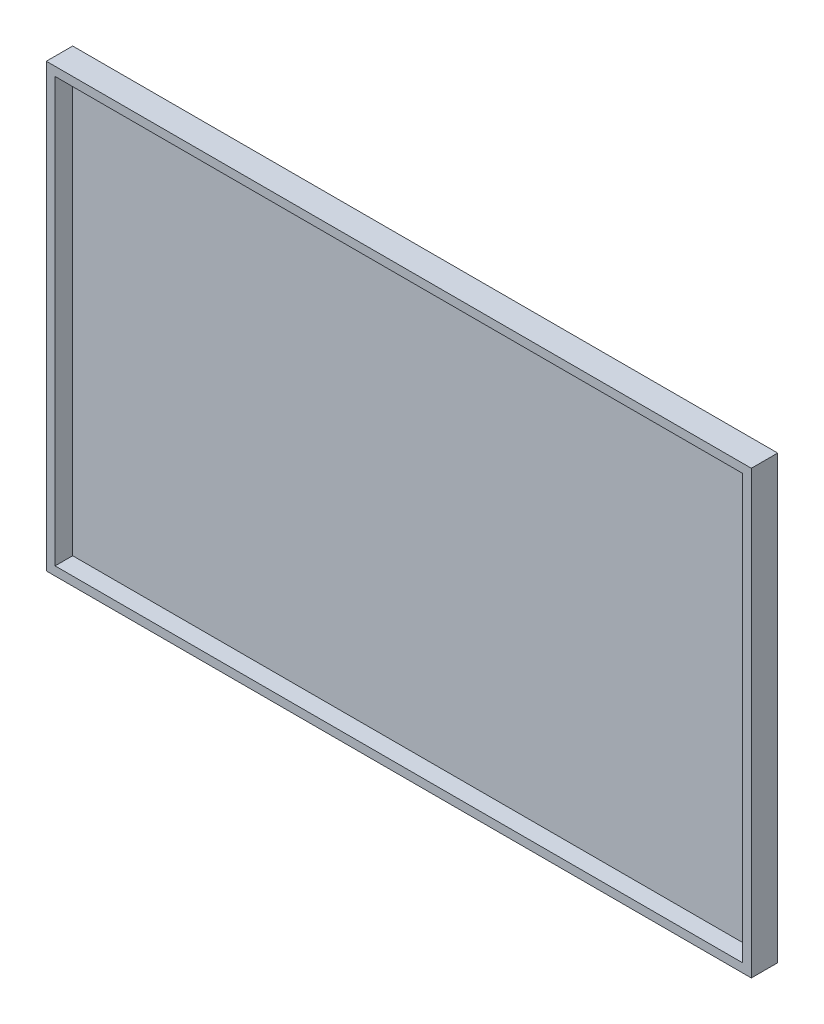
ISO-10303-21;
HEADER;
FILE_DESCRIPTION(('STEP AP214'),'2;1');
FILE_NAME('part.step','',(''),(''),'','','');
FILE_SCHEMA(('AUTOMOTIVE_DESIGN { 1 0 10303 214 1 1 1 1 }'));
ENDSEC;
DATA;
#1=APPLICATION_CONTEXT('core data for automotive mechanical design processes');
#2=APPLICATION_PROTOCOL_DEFINITION('international standard','automotive_design',2000,#1);
#3=PRODUCT_CONTEXT('',#1,'mechanical');
#4=PRODUCT('Part','Part','',(#3));
#5=PRODUCT_RELATED_PRODUCT_CATEGORY('part','',(#4));
#6=PRODUCT_DEFINITION_FORMATION('','',#4);
#7=PRODUCT_DEFINITION_CONTEXT('part definition',#1,'design');
#8=PRODUCT_DEFINITION('design','',#6,#7);
#9=PRODUCT_DEFINITION_SHAPE('','',#8);
#10=(LENGTH_UNIT() NAMED_UNIT(*) SI_UNIT(.MILLI.,.METRE.));
#11=(NAMED_UNIT(*) PLANE_ANGLE_UNIT() SI_UNIT($,.RADIAN.));
#12=(NAMED_UNIT(*) SI_UNIT($,.STERADIAN.) SOLID_ANGLE_UNIT());
#13=UNCERTAINTY_MEASURE_WITH_UNIT(LENGTH_MEASURE(1.E-05),#10,'distance_accuracy_value','');
#14=(GEOMETRIC_REPRESENTATION_CONTEXT(3) GLOBAL_UNCERTAINTY_ASSIGNED_CONTEXT((#13)) GLOBAL_UNIT_ASSIGNED_CONTEXT((#10,
#11,#12)) REPRESENTATION_CONTEXT('',''));
#15=CARTESIAN_POINT('',(0.,0.,0.));
#16=DIRECTION('',(0.,0.,1.));
#17=DIRECTION('',(1.,0.,0.));
#18=AXIS2_PLACEMENT_3D('',#15,#16,#17);
#19=CARTESIAN_POINT('',(-51.1381031613977,30.2179700499168,2.));
#20=DIRECTION('',(1.,0.,0.));
#21=DIRECTION('',(0.,1.,0.));
#22=AXIS2_PLACEMENT_3D('',#19,#20,#21);
#23=PLANE('',#22);
#24=DIRECTION('',(0.,-1.,0.));
#25=VECTOR('',#24,1.);
#26=CARTESIAN_POINT('',(-51.1381031613977,30.2179700499168,0.));
#27=LINE('',#26,#25);
#28=CARTESIAN_POINT('',(-51.1381031613977,30.2179700499168,0.));
#29=VERTEX_POINT('',#28);
#30=CARTESIAN_POINT('',(-51.1381031613976,-70.2820299500832,0.));
#31=VERTEX_POINT('',#30);
#32=EDGE_CURVE('E144',#29,#31,#27,.T.);
#33=ORIENTED_EDGE('',*,*,#32,.T.);
#34=DIRECTION('',(0.,0.,-1.));
#35=VECTOR('',#34,1.);
#36=CARTESIAN_POINT('',(-51.1381031613976,-70.2820299500832,2.));
#37=LINE('',#36,#35);
#38=CARTESIAN_POINT('',(-51.1381031613977,-70.2820299500832,6.));
#39=VERTEX_POINT('',#38);
#40=EDGE_CURVE('E11',#39,#31,#37,.T.);
#41=ORIENTED_EDGE('',*,*,#40,.F.);
#42=DIRECTION('',(0.,-1.,0.));
#43=VECTOR('',#42,1.);
#44=CARTESIAN_POINT('',(-51.1381031613977,30.2179700499168,6.));
#45=LINE('',#44,#43);
#46=CARTESIAN_POINT('',(-51.1381031613977,30.2179700499168,6.));
#47=VERTEX_POINT('',#46);
#48=EDGE_CURVE('E111',#47,#39,#45,.T.);
#49=ORIENTED_EDGE('',*,*,#48,.F.);
#50=DIRECTION('',(0.,0.,-1.));
#51=VECTOR('',#50,1.);
#52=CARTESIAN_POINT('',(-51.1381031613977,30.2179700499168,2.));
#53=LINE('',#52,#51);
#54=EDGE_CURVE('E153',#47,#29,#53,.T.);
#55=ORIENTED_EDGE('',*,*,#54,.T.);
#56=EDGE_LOOP('',(#33,#41,#49,#55));
#57=FACE_BOUND('',#56,.T.);
#58=ADVANCED_FACE('F33',(#57),#23,.F.);
#59=CARTESIAN_POINT('',(-51.1381031613976,-70.2820299500832,2.));
#60=DIRECTION('',(0.,1.,0.));
#61=DIRECTION('',(0.,0.,1.));
#62=AXIS2_PLACEMENT_3D('',#59,#60,#61);
#63=PLANE('',#62);
#64=DIRECTION('',(1.,0.,0.));
#65=VECTOR('',#64,1.);
#66=CARTESIAN_POINT('',(-51.1381031613976,-70.2820299500832,0.));
#67=LINE('',#66,#65);
#68=CARTESIAN_POINT('',(109.361896838602,-70.2820299500832,0.));
#69=VERTEX_POINT('',#68);
#70=EDGE_CURVE('E147',#31,#69,#67,.T.);
#71=ORIENTED_EDGE('',*,*,#70,.T.);
#72=DIRECTION('',(0.,0.,-1.));
#73=VECTOR('',#72,1.);
#74=CARTESIAN_POINT('',(109.361896838602,-70.2820299500832,2.));
#75=LINE('',#74,#73);
#76=CARTESIAN_POINT('',(109.361896838602,-70.2820299500832,6.));
#77=VERTEX_POINT('',#76);
#78=EDGE_CURVE('E40',#77,#69,#75,.T.);
#79=ORIENTED_EDGE('',*,*,#78,.F.);
#80=DIRECTION('',(1.,0.,0.));
#81=VECTOR('',#80,1.);
#82=CARTESIAN_POINT('',(-51.1381031613977,-70.2820299500832,6.));
#83=LINE('',#82,#81);
#84=EDGE_CURVE('E135',#39,#77,#83,.T.);
#85=ORIENTED_EDGE('',*,*,#84,.F.);
#86=ORIENTED_EDGE('',*,*,#40,.T.);
#87=EDGE_LOOP('',(#71,#79,#85,#86));
#88=FACE_BOUND('',#87,.T.);
#89=ADVANCED_FACE('F175',(#88),#63,.F.);
#90=CARTESIAN_POINT('',(109.361896838602,30.2179700499168,2.));
#91=DIRECTION('',(-1.,0.,0.));
#92=DIRECTION('',(0.,0.,1.));
#93=AXIS2_PLACEMENT_3D('',#90,#91,#92);
#94=PLANE('',#93);
#95=DIRECTION('',(0.,1.,0.));
#96=VECTOR('',#95,1.);
#97=CARTESIAN_POINT('',(109.361896838602,30.2179700499168,0.));
#98=LINE('',#97,#96);
#99=CARTESIAN_POINT('',(109.361896838602,30.2179700499168,0.));
#100=VERTEX_POINT('',#99);
#101=EDGE_CURVE('E149',#69,#100,#98,.T.);
#102=ORIENTED_EDGE('',*,*,#101,.T.);
#103=DIRECTION('',(0.,0.,-1.));
#104=VECTOR('',#103,1.);
#105=CARTESIAN_POINT('',(109.361896838602,30.2179700499168,2.));
#106=LINE('',#105,#104);
#107=CARTESIAN_POINT('',(109.361896838602,30.2179700499168,6.));
#108=VERTEX_POINT('',#107);
#109=EDGE_CURVE('E156',#108,#100,#106,.T.);
#110=ORIENTED_EDGE('',*,*,#109,.F.);
#111=DIRECTION('',(0.,1.,0.));
#112=VECTOR('',#111,1.);
#113=CARTESIAN_POINT('',(109.361896838602,30.2179700499168,6.));
#114=LINE('',#113,#112);
#115=EDGE_CURVE('E138',#77,#108,#114,.T.);
#116=ORIENTED_EDGE('',*,*,#115,.F.);
#117=ORIENTED_EDGE('',*,*,#78,.T.);
#118=EDGE_LOOP('',(#102,#110,#116,#117));
#119=FACE_BOUND('',#118,.T.);
#120=ADVANCED_FACE('F162',(#119),#94,.F.);
#121=CARTESIAN_POINT('',(-51.1381031613977,30.2179700499168,2.));
#122=DIRECTION('',(0.,-1.,0.));
#123=DIRECTION('',(0.,0.,-1.));
#124=AXIS2_PLACEMENT_3D('',#121,#122,#123);
#125=PLANE('',#124);
#126=DIRECTION('',(-1.,0.,0.));
#127=VECTOR('',#126,1.);
#128=CARTESIAN_POINT('',(-51.1381031613977,30.2179700499168,0.));
#129=LINE('',#128,#127);
#130=EDGE_CURVE('E151',#100,#29,#129,.T.);
#131=ORIENTED_EDGE('',*,*,#130,.T.);
#132=ORIENTED_EDGE('',*,*,#54,.F.);
#133=DIRECTION('',(-1.,0.,0.));
#134=VECTOR('',#133,1.);
#135=CARTESIAN_POINT('',(-51.1381031613977,30.2179700499168,6.));
#136=LINE('',#135,#134);
#137=EDGE_CURVE('E141',#108,#47,#136,.T.);
#138=ORIENTED_EDGE('',*,*,#137,.F.);
#139=ORIENTED_EDGE('',*,*,#109,.T.);
#140=EDGE_LOOP('',(#131,#132,#138,#139));
#141=FACE_BOUND('',#140,.T.);
#142=ADVANCED_FACE('F170',(#141),#125,.F.);
#143=CARTESIAN_POINT('',(0.,0.,0.));
#144=DIRECTION('',(0.,0.,1.));
#145=DIRECTION('',(1.,0.,0.));
#146=AXIS2_PLACEMENT_3D('',#143,#144,#145);
#147=PLANE('',#146);
#148=ORIENTED_EDGE('',*,*,#32,.F.);
#149=ORIENTED_EDGE('',*,*,#130,.F.);
#150=ORIENTED_EDGE('',*,*,#101,.F.);
#151=ORIENTED_EDGE('',*,*,#70,.F.);
#152=EDGE_LOOP('',(#148,#149,#150,#151));
#153=FACE_BOUND('',#152,.T.);
#154=ADVANCED_FACE('F168',(#153),#147,.F.);
#155=CARTESIAN_POINT('',(0.,0.,6.));
#156=DIRECTION('',(0.,0.,1.));
#157=DIRECTION('',(1.,0.,0.));
#158=AXIS2_PLACEMENT_3D('',#155,#156,#157);
#159=PLANE('',#158);
#160=ORIENTED_EDGE('',*,*,#48,.T.);
#161=ORIENTED_EDGE('',*,*,#84,.T.);
#162=ORIENTED_EDGE('',*,*,#115,.T.);
#163=ORIENTED_EDGE('',*,*,#137,.T.);
#164=EDGE_LOOP('',(#160,#161,#162,#163));
#165=FACE_BOUND('',#164,.T.);
#166=DIRECTION('',(1.,0.,0.));
#167=VECTOR('',#166,1.);
#168=CARTESIAN_POINT('',(-49.1381031613976,-68.2820299500832,6.));
#169=LINE('',#168,#167);
#170=CARTESIAN_POINT('',(-49.1381031613976,-68.2820299500832,6.));
#171=VERTEX_POINT('',#170);
#172=CARTESIAN_POINT('',(107.361896838602,-68.2820299500832,6.));
#173=VERTEX_POINT('',#172);
#174=EDGE_CURVE('E105',#171,#173,#169,.T.);
#175=ORIENTED_EDGE('',*,*,#174,.F.);
#176=DIRECTION('',(0.,-1.,0.));
#177=VECTOR('',#176,1.);
#178=CARTESIAN_POINT('',(-49.1381031613977,28.2179700499168,6.));
#179=LINE('',#178,#177);
#180=CARTESIAN_POINT('',(-49.1381031613977,28.2179700499168,6.));
#181=VERTEX_POINT('',#180);
#182=EDGE_CURVE('E96',#181,#171,#179,.T.);
#183=ORIENTED_EDGE('',*,*,#182,.F.);
#184=DIRECTION('',(-1.,0.,0.));
#185=VECTOR('',#184,1.);
#186=CARTESIAN_POINT('',(-49.1381031613977,28.2179700499168,6.));
#187=LINE('',#186,#185);
#188=CARTESIAN_POINT('',(107.361896838602,28.2179700499168,6.));
#189=VERTEX_POINT('',#188);
#190=EDGE_CURVE('E119',#189,#181,#187,.T.);
#191=ORIENTED_EDGE('',*,*,#190,.F.);
#192=DIRECTION('',(0.,1.,0.));
#193=VECTOR('',#192,1.);
#194=CARTESIAN_POINT('',(107.361896838602,28.2179700499168,6.));
#195=LINE('',#194,#193);
#196=EDGE_CURVE('E117',#173,#189,#195,.T.);
#197=ORIENTED_EDGE('',*,*,#196,.F.);
#198=EDGE_LOOP('',(#175,#183,#191,#197));
#199=FACE_BOUND('',#198,.T.);
#200=ADVANCED_FACE('F115',(#165,#199),#159,.T.);
#201=CARTESIAN_POINT('',(-49.1381031613977,28.2179700499168,6.));
#202=DIRECTION('',(1.,0.,0.));
#203=DIRECTION('',(0.,1.,0.));
#204=AXIS2_PLACEMENT_3D('',#201,#202,#203);
#205=PLANE('',#204);
#206=DIRECTION('',(0.,-1.,0.));
#207=VECTOR('',#206,1.);
#208=CARTESIAN_POINT('',(-49.1381031613977,28.2179700499168,2.));
#209=LINE('',#208,#207);
#210=CARTESIAN_POINT('',(-49.1381031613977,28.2179700499168,2.));
#211=VERTEX_POINT('',#210);
#212=CARTESIAN_POINT('',(-49.1381031613976,-68.2820299500832,2.));
#213=VERTEX_POINT('',#212);
#214=EDGE_CURVE('E47',#211,#213,#209,.T.);
#215=ORIENTED_EDGE('',*,*,#214,.F.);
#216=DIRECTION('',(0.,0.,-1.));
#217=VECTOR('',#216,1.);
#218=CARTESIAN_POINT('',(-49.1381031613977,28.2179700499168,6.));
#219=LINE('',#218,#217);
#220=EDGE_CURVE('E101',#181,#211,#219,.T.);
#221=ORIENTED_EDGE('',*,*,#220,.F.);
#222=ORIENTED_EDGE('',*,*,#182,.T.);
#223=DIRECTION('',(0.,0.,-1.));
#224=VECTOR('',#223,1.);
#225=CARTESIAN_POINT('',(-49.1381031613976,-68.2820299500832,6.));
#226=LINE('',#225,#224);
#227=EDGE_CURVE('E99',#171,#213,#226,.T.);
#228=ORIENTED_EDGE('',*,*,#227,.T.);
#229=EDGE_LOOP('',(#215,#221,#222,#228));
#230=FACE_BOUND('',#229,.T.);
#231=ADVANCED_FACE('F98',(#230),#205,.T.);
#232=CARTESIAN_POINT('',(-49.1381031613976,-68.2820299500832,6.));
#233=DIRECTION('',(0.,1.,0.));
#234=DIRECTION('',(0.,0.,1.));
#235=AXIS2_PLACEMENT_3D('',#232,#233,#234);
#236=PLANE('',#235);
#237=DIRECTION('',(1.,0.,0.));
#238=VECTOR('',#237,1.);
#239=CARTESIAN_POINT('',(-49.1381031613976,-68.2820299500832,2.));
#240=LINE('',#239,#238);
#241=CARTESIAN_POINT('',(107.361896838602,-68.2820299500832,2.));
#242=VERTEX_POINT('',#241);
#243=EDGE_CURVE('E51',#213,#242,#240,.T.);
#244=ORIENTED_EDGE('',*,*,#243,.F.);
#245=ORIENTED_EDGE('',*,*,#227,.F.);
#246=ORIENTED_EDGE('',*,*,#174,.T.);
#247=DIRECTION('',(0.,0.,-1.));
#248=VECTOR('',#247,1.);
#249=CARTESIAN_POINT('',(107.361896838602,-68.2820299500832,6.));
#250=LINE('',#249,#248);
#251=EDGE_CURVE('E112',#173,#242,#250,.T.);
#252=ORIENTED_EDGE('',*,*,#251,.T.);
#253=EDGE_LOOP('',(#244,#245,#246,#252));
#254=FACE_BOUND('',#253,.T.);
#255=ADVANCED_FACE('F109',(#254),#236,.T.);
#256=CARTESIAN_POINT('',(107.361896838602,28.2179700499168,6.));
#257=DIRECTION('',(-1.,0.,0.));
#258=DIRECTION('',(0.,-1.,0.));
#259=AXIS2_PLACEMENT_3D('',#256,#257,#258);
#260=PLANE('',#259);
#261=DIRECTION('',(0.,1.,0.));
#262=VECTOR('',#261,1.);
#263=CARTESIAN_POINT('',(107.361896838602,28.2179700499168,2.));
#264=LINE('',#263,#262);
#265=CARTESIAN_POINT('',(107.361896838602,28.2179700499168,2.));
#266=VERTEX_POINT('',#265);
#267=EDGE_CURVE('E125',#242,#266,#264,.T.);
#268=ORIENTED_EDGE('',*,*,#267,.F.);
#269=ORIENTED_EDGE('',*,*,#251,.F.);
#270=ORIENTED_EDGE('',*,*,#196,.T.);
#271=DIRECTION('',(0.,0.,-1.));
#272=VECTOR('',#271,1.);
#273=CARTESIAN_POINT('',(107.361896838602,28.2179700499168,6.));
#274=LINE('',#273,#272);
#275=EDGE_CURVE('E129',#189,#266,#274,.T.);
#276=ORIENTED_EDGE('',*,*,#275,.T.);
#277=EDGE_LOOP('',(#268,#269,#270,#276));
#278=FACE_BOUND('',#277,.T.);
#279=ADVANCED_FACE('F197',(#278),#260,.T.);
#280=CARTESIAN_POINT('',(-49.1381031613977,28.2179700499168,6.));
#281=DIRECTION('',(0.,-1.,0.));
#282=DIRECTION('',(0.,0.,-1.));
#283=AXIS2_PLACEMENT_3D('',#280,#281,#282);
#284=PLANE('',#283);
#285=DIRECTION('',(-1.,0.,0.));
#286=VECTOR('',#285,1.);
#287=CARTESIAN_POINT('',(-49.1381031613977,28.2179700499168,2.));
#288=LINE('',#287,#286);
#289=EDGE_CURVE('E106',#266,#211,#288,.T.);
#290=ORIENTED_EDGE('',*,*,#289,.F.);
#291=ORIENTED_EDGE('',*,*,#275,.F.);
#292=ORIENTED_EDGE('',*,*,#190,.T.);
#293=ORIENTED_EDGE('',*,*,#220,.T.);
#294=EDGE_LOOP('',(#290,#291,#292,#293));
#295=FACE_BOUND('',#294,.T.);
#296=ADVANCED_FACE('F190',(#295),#284,.T.);
#297=CARTESIAN_POINT('',(0.,0.,2.));
#298=DIRECTION('',(0.,0.,1.));
#299=DIRECTION('',(1.,0.,0.));
#300=AXIS2_PLACEMENT_3D('',#297,#298,#299);
#301=PLANE('',#300);
#302=ORIENTED_EDGE('',*,*,#214,.T.);
#303=ORIENTED_EDGE('',*,*,#243,.T.);
#304=ORIENTED_EDGE('',*,*,#267,.T.);
#305=ORIENTED_EDGE('',*,*,#289,.T.);
#306=EDGE_LOOP('',(#302,#303,#304,#305));
#307=FACE_BOUND('',#306,.T.);
#308=ADVANCED_FACE('F187',(#307),#301,.T.);
#309=CLOSED_SHELL('',(#58,#89,#120,#142,#154,#200,#231,#255,#279,#296,#308));
#310=MANIFOLD_SOLID_BREP('B2',#309);
#311=ADVANCED_BREP_SHAPE_REPRESENTATION('',(#18,#310),#14);
#312=SHAPE_DEFINITION_REPRESENTATION(#9,#311);
ENDSEC;
END-ISO-10303-21;
